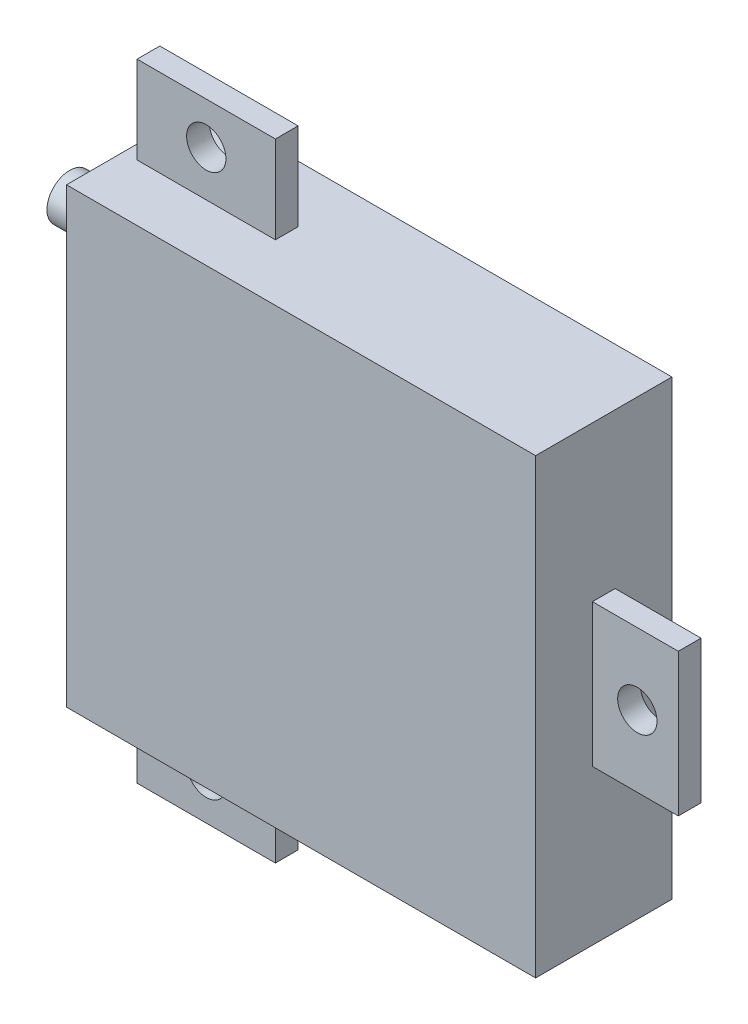
ISO-10303-21;
HEADER;
FILE_DESCRIPTION(('STEP AP214'),'2;1');
FILE_NAME('part.step','',(''),(''),'','','');
FILE_SCHEMA(('AUTOMOTIVE_DESIGN { 1 0 10303 214 1 1 1 1 }'));
ENDSEC;
DATA;
#1=APPLICATION_CONTEXT('core data for automotive mechanical design processes');
#2=APPLICATION_PROTOCOL_DEFINITION('international standard','automotive_design',2000,#1);
#3=PRODUCT_CONTEXT('',#1,'mechanical');
#4=PRODUCT('Part','Part','',(#3));
#5=PRODUCT_RELATED_PRODUCT_CATEGORY('part','',(#4));
#6=PRODUCT_DEFINITION_FORMATION('','',#4);
#7=PRODUCT_DEFINITION_CONTEXT('part definition',#1,'design');
#8=PRODUCT_DEFINITION('design','',#6,#7);
#9=PRODUCT_DEFINITION_SHAPE('','',#8);
#10=(LENGTH_UNIT() NAMED_UNIT(*) SI_UNIT(.MILLI.,.METRE.));
#11=(NAMED_UNIT(*) PLANE_ANGLE_UNIT() SI_UNIT($,.RADIAN.));
#12=(NAMED_UNIT(*) SI_UNIT($,.STERADIAN.) SOLID_ANGLE_UNIT());
#13=UNCERTAINTY_MEASURE_WITH_UNIT(LENGTH_MEASURE(1.E-05),#10,'distance_accuracy_value','');
#14=(GEOMETRIC_REPRESENTATION_CONTEXT(3) GLOBAL_UNCERTAINTY_ASSIGNED_CONTEXT((#13)) GLOBAL_UNIT_ASSIGNED_CONTEXT((#10,
#11,#12)) REPRESENTATION_CONTEXT('',''));
#15=CARTESIAN_POINT('',(0.,0.,0.));
#16=DIRECTION('',(0.,0.,1.));
#17=DIRECTION('',(1.,0.,0.));
#18=AXIS2_PLACEMENT_3D('',#15,#16,#17);
#19=CARTESIAN_POINT('',(100.173594780694,49.397945873676,3.9624));
#20=DIRECTION('',(1.,0.,0.));
#21=DIRECTION('',(0.,0.,-1.));
#22=AXIS2_PLACEMENT_3D('',#19,#20,#21);
#23=PLANE('',#22);
#24=DIRECTION('',(0.,-1.,0.));
#25=VECTOR('',#24,1.);
#26=CARTESIAN_POINT('',(100.173594780694,49.397945873676,0.));
#27=LINE('',#26,#25);
#28=CARTESIAN_POINT('',(100.173594780694,49.397945873676,0.));
#29=VERTEX_POINT('',#28);
#30=CARTESIAN_POINT('',(100.173594780694,17.8257458736761,0.));
#31=VERTEX_POINT('',#30);
#32=EDGE_CURVE('E154',#29,#31,#27,.T.);
#33=ORIENTED_EDGE('',*,*,#32,.T.);
#34=DIRECTION('',(0.,0.,-1.));
#35=VECTOR('',#34,1.);
#36=CARTESIAN_POINT('',(100.173594780694,17.8257458736761,3.9624));
#37=LINE('',#36,#35);
#38=CARTESIAN_POINT('',(100.173594780694,17.8257458736761,9.5123));
#39=VERTEX_POINT('',#38);
#40=EDGE_CURVE('E147',#39,#31,#37,.T.);
#41=ORIENTED_EDGE('',*,*,#40,.F.);
#42=DIRECTION('',(0.,-1.,0.));
#43=VECTOR('',#42,1.);
#44=CARTESIAN_POINT('',(100.173594780694,49.397945873676,9.5123));
#45=LINE('',#44,#43);
#46=CARTESIAN_POINT('',(100.173594780694,49.397945873676,9.5123));
#47=VERTEX_POINT('',#46);
#48=EDGE_CURVE('E152',#47,#39,#45,.T.);
#49=ORIENTED_EDGE('',*,*,#48,.F.);
#50=DIRECTION('',(0.,0.,-1.));
#51=VECTOR('',#50,1.);
#52=CARTESIAN_POINT('',(100.173594780694,49.397945873676,3.9624));
#53=LINE('',#52,#51);
#54=EDGE_CURVE('E257',#47,#29,#53,.T.);
#55=ORIENTED_EDGE('',*,*,#54,.T.);
#56=EDGE_LOOP('',(#33,#41,#49,#55));
#57=FACE_BOUND('',#56,.T.);
#58=CARTESIAN_POINT('',(100.173594780694,43.809945873676,4.52755));
#59=DIRECTION('',(1.,0.,0.));
#60=DIRECTION('',(0.,0.,-1.));
#61=AXIS2_PLACEMENT_3D('',#58,#59,#60);
#62=CIRCLE('',#61,1.5875);
#63=CARTESIAN_POINT('',(100.173594780694,43.809945873676,2.94005));
#64=VERTEX_POINT('',#63);
#65=EDGE_CURVE('E11',#64,#64,#62,.F.);
#66=ORIENTED_EDGE('',*,*,#65,.F.);
#67=EDGE_LOOP('',(#66));
#68=FACE_BOUND('',#67,.T.);
#69=ADVANCED_FACE('F33',(#57,#68),#23,.F.);
#70=CARTESIAN_POINT('',(0.,0.,5.5499));
#71=DIRECTION('',(0.,0.,-1.));
#72=DIRECTION('',(-1.,0.,0.));
#73=AXIS2_PLACEMENT_3D('',#70,#71,#72);
#74=PLANE('',#73);
#75=CARTESIAN_POINT('',(105.964794780695,52.572945873676,5.5499));
#76=DIRECTION('',(0.,0.,1.));
#77=DIRECTION('',(1.,0.,0.));
#78=AXIS2_PLACEMENT_3D('',#75,#76,#77);
#79=CIRCLE('',#78,1.3716);
#80=CARTESIAN_POINT('',(107.336394780695,52.572945873676,5.5499));
#81=VERTEX_POINT('',#80);
#82=EDGE_CURVE('E186',#81,#81,#79,.T.);
#83=ORIENTED_EDGE('',*,*,#82,.F.);
#84=EDGE_LOOP('',(#83));
#85=FACE_BOUND('',#84,.T.);
#86=DIRECTION('',(-1.,0.,0.));
#87=VECTOR('',#86,1.);
#88=CARTESIAN_POINT('',(100.173594780694,49.397945873676,5.5499));
#89=LINE('',#88,#87);
#90=CARTESIAN_POINT('',(110.790794780694,49.397945873676,5.5499));
#91=VERTEX_POINT('',#90);
#92=CARTESIAN_POINT('',(101.138794780694,49.397945873676,5.5499));
#93=VERTEX_POINT('',#92);
#94=EDGE_CURVE('E40',#91,#93,#89,.T.);
#95=ORIENTED_EDGE('',*,*,#94,.F.);
#96=DIRECTION('',(0.,1.,0.));
#97=VECTOR('',#96,1.);
#98=CARTESIAN_POINT('',(110.790794780694,49.397945873676,5.5499));
#99=LINE('',#98,#97);
#100=CARTESIAN_POINT('',(110.790794780694,55.4939458736762,5.5499));
#101=VERTEX_POINT('',#100);
#102=EDGE_CURVE('E209',#91,#101,#99,.T.);
#103=ORIENTED_EDGE('',*,*,#102,.T.);
#104=DIRECTION('',(-1.,0.,0.));
#105=VECTOR('',#104,1.);
#106=CARTESIAN_POINT('',(101.138794780694,55.4939458736762,5.5499));
#107=LINE('',#106,#105);
#108=CARTESIAN_POINT('',(101.138794780694,55.4939458736762,5.5499));
#109=VERTEX_POINT('',#108);
#110=EDGE_CURVE('E206',#101,#109,#107,.T.);
#111=ORIENTED_EDGE('',*,*,#110,.T.);
#112=DIRECTION('',(0.,-1.,0.));
#113=VECTOR('',#112,1.);
#114=CARTESIAN_POINT('',(101.138794780694,49.397945873676,5.5499));
#115=LINE('',#114,#113);
#116=EDGE_CURVE('E208',#109,#93,#115,.T.);
#117=ORIENTED_EDGE('',*,*,#116,.T.);
#118=EDGE_LOOP('',(#95,#103,#111,#117));
#119=FACE_BOUND('',#118,.T.);
#120=ADVANCED_FACE('F289',(#85,#119),#74,.F.);
#121=CARTESIAN_POINT('',(136.050967198386,33.6118458736753,5.5499));
#122=DIRECTION('',(0.,0.,1.));
#123=DIRECTION('',(1.,0.,0.));
#124=AXIS2_PLACEMENT_3D('',#121,#122,#123);
#125=CIRCLE('',#124,1.3716);
#126=CARTESIAN_POINT('',(137.422567198386,33.6118458736753,5.5499));
#127=VERTEX_POINT('',#126);
#128=EDGE_CURVE('E192',#127,#127,#125,.T.);
#129=ORIENTED_EDGE('',*,*,#128,.F.);
#130=EDGE_LOOP('',(#129));
#131=FACE_BOUND('',#130,.T.);
#132=DIRECTION('',(0.,1.,0.));
#133=VECTOR('',#132,1.);
#134=CARTESIAN_POINT('',(132.914194780693,49.397945873676,5.5499));
#135=LINE('',#134,#133);
#136=CARTESIAN_POINT('',(132.914194780693,28.6334458736761,5.5499));
#137=VERTEX_POINT('',#136);
#138=CARTESIAN_POINT('',(132.914194780693,38.590245873676,5.5499));
#139=VERTEX_POINT('',#138);
#140=EDGE_CURVE('E320',#137,#139,#135,.T.);
#141=ORIENTED_EDGE('',*,*,#140,.F.);
#142=DIRECTION('',(1.,0.,0.));
#143=VECTOR('',#142,1.);
#144=CARTESIAN_POINT('',(132.914194780693,28.6334458736761,5.5499));
#145=LINE('',#144,#143);
#146=CARTESIAN_POINT('',(138.908594780693,28.6334458736761,5.5499));
#147=VERTEX_POINT('',#146);
#148=EDGE_CURVE('E205',#137,#147,#145,.T.);
#149=ORIENTED_EDGE('',*,*,#148,.T.);
#150=DIRECTION('',(0.,1.,0.));
#151=VECTOR('',#150,1.);
#152=CARTESIAN_POINT('',(138.908594780693,38.590245873676,5.5499));
#153=LINE('',#152,#151);
#154=CARTESIAN_POINT('',(138.908594780693,38.590245873676,5.5499));
#155=VERTEX_POINT('',#154);
#156=EDGE_CURVE('E202',#147,#155,#153,.T.);
#157=ORIENTED_EDGE('',*,*,#156,.T.);
#158=DIRECTION('',(-1.,0.,0.));
#159=VECTOR('',#158,1.);
#160=CARTESIAN_POINT('',(132.914194780693,38.590245873676,5.5499));
#161=LINE('',#160,#159);
#162=EDGE_CURVE('E204',#155,#139,#161,.T.);
#163=ORIENTED_EDGE('',*,*,#162,.T.);
#164=EDGE_LOOP('',(#141,#149,#157,#163));
#165=FACE_BOUND('',#164,.T.);
#166=ADVANCED_FACE('F293',(#131,#165),#74,.F.);
#167=CARTESIAN_POINT('',(105.964794780695,14.6507458736761,5.5499));
#168=DIRECTION('',(0.,0.,1.));
#169=DIRECTION('',(1.,0.,0.));
#170=AXIS2_PLACEMENT_3D('',#167,#168,#169);
#171=CIRCLE('',#170,1.3716);
#172=CARTESIAN_POINT('',(107.336394780695,14.6507458736761,5.5499));
#173=VERTEX_POINT('',#172);
#174=EDGE_CURVE('E180',#173,#173,#171,.T.);
#175=ORIENTED_EDGE('',*,*,#174,.F.);
#176=EDGE_LOOP('',(#175));
#177=FACE_BOUND('',#176,.T.);
#178=DIRECTION('',(1.,0.,0.));
#179=VECTOR('',#178,1.);
#180=CARTESIAN_POINT('',(132.914194780693,17.8257458736761,5.5499));
#181=LINE('',#180,#179);
#182=CARTESIAN_POINT('',(101.138794780694,17.8257458736761,5.5499));
#183=VERTEX_POINT('',#182);
#184=CARTESIAN_POINT('',(110.790794780694,17.8257458736761,5.5499));
#185=VERTEX_POINT('',#184);
#186=EDGE_CURVE('E156',#183,#185,#181,.T.);
#187=ORIENTED_EDGE('',*,*,#186,.F.);
#188=DIRECTION('',(0.,-1.,0.));
#189=VECTOR('',#188,1.);
#190=CARTESIAN_POINT('',(101.138794780694,17.8257458736761,5.5499));
#191=LINE('',#190,#189);
#192=CARTESIAN_POINT('',(101.138794780694,11.7297458736759,5.5499));
#193=VERTEX_POINT('',#192);
#194=EDGE_CURVE('E201',#183,#193,#191,.T.);
#195=ORIENTED_EDGE('',*,*,#194,.T.);
#196=DIRECTION('',(1.,0.,0.));
#197=VECTOR('',#196,1.);
#198=CARTESIAN_POINT('',(101.138794780694,11.7297458736759,5.5499));
#199=LINE('',#198,#197);
#200=CARTESIAN_POINT('',(110.790794780694,11.7297458736759,5.5499));
#201=VERTEX_POINT('',#200);
#202=EDGE_CURVE('E198',#193,#201,#199,.T.);
#203=ORIENTED_EDGE('',*,*,#202,.T.);
#204=DIRECTION('',(0.,1.,0.));
#205=VECTOR('',#204,1.);
#206=CARTESIAN_POINT('',(110.790794780694,17.8257458736761,5.5499));
#207=LINE('',#206,#205);
#208=EDGE_CURVE('E200',#201,#185,#207,.T.);
#209=ORIENTED_EDGE('',*,*,#208,.T.);
#210=EDGE_LOOP('',(#187,#195,#203,#209));
#211=FACE_BOUND('',#210,.T.);
#212=ADVANCED_FACE('F296',(#177,#211),#74,.F.);
#213=CARTESIAN_POINT('',(132.914194780693,17.8257458736761,3.9624));
#214=DIRECTION('',(0.,1.,0.));
#215=DIRECTION('',(0.,0.,1.));
#216=AXIS2_PLACEMENT_3D('',#213,#214,#215);
#217=PLANE('',#216);
#218=DIRECTION('',(0.,0.,-1.));
#219=VECTOR('',#218,1.);
#220=CARTESIAN_POINT('',(101.138794780694,17.8257458736761,5.5499));
#221=LINE('',#220,#219);
#222=CARTESIAN_POINT('',(101.138794780694,17.8257458736761,3.9624));
#223=VERTEX_POINT('',#222);
#224=EDGE_CURVE('E244',#183,#223,#221,.T.);
#225=ORIENTED_EDGE('',*,*,#224,.F.);
#226=ORIENTED_EDGE('',*,*,#186,.T.);
#227=DIRECTION('',(0.,0.,-1.));
#228=VECTOR('',#227,1.);
#229=CARTESIAN_POINT('',(110.790794780694,17.8257458736761,5.5499));
#230=LINE('',#229,#228);
#231=CARTESIAN_POINT('',(110.790794780694,17.8257458736761,3.9624));
#232=VERTEX_POINT('',#231);
#233=EDGE_CURVE('E241',#185,#232,#230,.T.);
#234=ORIENTED_EDGE('',*,*,#233,.T.);
#235=DIRECTION('',(1.,0.,0.));
#236=VECTOR('',#235,1.);
#237=CARTESIAN_POINT('',(132.914194780693,17.8257458736761,3.9624));
#238=LINE('',#237,#236);
#239=EDGE_CURVE('E250',#223,#232,#238,.T.);
#240=ORIENTED_EDGE('',*,*,#239,.F.);
#241=EDGE_LOOP('',(#225,#226,#234,#240));
#242=FACE_BOUND('',#241,.T.);
#243=DIRECTION('',(1.,0.,0.));
#244=VECTOR('',#243,1.);
#245=CARTESIAN_POINT('',(132.914194780693,17.8257458736761,0.));
#246=LINE('',#245,#244);
#247=CARTESIAN_POINT('',(132.914194780693,17.8257458736761,0.));
#248=VERTEX_POINT('',#247);
#249=EDGE_CURVE('E262',#31,#248,#246,.T.);
#250=ORIENTED_EDGE('',*,*,#249,.T.);
#251=DIRECTION('',(0.,0.,-1.));
#252=VECTOR('',#251,1.);
#253=CARTESIAN_POINT('',(132.914194780693,17.8257458736761,3.9624));
#254=LINE('',#253,#252);
#255=CARTESIAN_POINT('',(132.914194780693,17.8257458736761,9.5123));
#256=VERTEX_POINT('',#255);
#257=EDGE_CURVE('E157',#256,#248,#254,.T.);
#258=ORIENTED_EDGE('',*,*,#257,.F.);
#259=DIRECTION('',(1.,0.,0.));
#260=VECTOR('',#259,1.);
#261=CARTESIAN_POINT('',(132.914194780693,17.8257458736761,9.5123));
#262=LINE('',#261,#260);
#263=EDGE_CURVE('E160',#39,#256,#262,.T.);
#264=ORIENTED_EDGE('',*,*,#263,.F.);
#265=ORIENTED_EDGE('',*,*,#40,.T.);
#266=EDGE_LOOP('',(#250,#258,#264,#265));
#267=FACE_BOUND('',#266,.T.);
#268=ADVANCED_FACE('F161',(#242,#267),#217,.F.);
#269=CARTESIAN_POINT('',(132.914194780693,49.397945873676,3.9624));
#270=DIRECTION('',(-1.,0.,0.));
#271=DIRECTION('',(0.,0.,1.));
#272=AXIS2_PLACEMENT_3D('',#269,#270,#271);
#273=PLANE('',#272);
#274=DIRECTION('',(0.,0.,-1.));
#275=VECTOR('',#274,1.);
#276=CARTESIAN_POINT('',(132.914194780693,28.6334458736761,5.5499));
#277=LINE('',#276,#275);
#278=CARTESIAN_POINT('',(132.914194780693,28.6334458736761,3.9624));
#279=VERTEX_POINT('',#278);
#280=EDGE_CURVE('E236',#137,#279,#277,.T.);
#281=ORIENTED_EDGE('',*,*,#280,.F.);
#282=ORIENTED_EDGE('',*,*,#140,.T.);
#283=DIRECTION('',(0.,0.,-1.));
#284=VECTOR('',#283,1.);
#285=CARTESIAN_POINT('',(132.914194780693,38.590245873676,5.5499));
#286=LINE('',#285,#284);
#287=CARTESIAN_POINT('',(132.914194780693,38.590245873676,3.9624));
#288=VERTEX_POINT('',#287);
#289=EDGE_CURVE('E233',#139,#288,#286,.T.);
#290=ORIENTED_EDGE('',*,*,#289,.T.);
#291=DIRECTION('',(0.,1.,0.));
#292=VECTOR('',#291,1.);
#293=CARTESIAN_POINT('',(132.914194780693,49.397945873676,3.9624));
#294=LINE('',#293,#292);
#295=EDGE_CURVE('E252',#279,#288,#294,.T.);
#296=ORIENTED_EDGE('',*,*,#295,.F.);
#297=EDGE_LOOP('',(#281,#282,#290,#296));
#298=FACE_BOUND('',#297,.T.);
#299=DIRECTION('',(0.,1.,0.));
#300=VECTOR('',#299,1.);
#301=CARTESIAN_POINT('',(132.914194780693,49.397945873676,0.));
#302=LINE('',#301,#300);
#303=CARTESIAN_POINT('',(132.914194780693,49.397945873676,0.));
#304=VERTEX_POINT('',#303);
#305=EDGE_CURVE('E264',#248,#304,#302,.T.);
#306=ORIENTED_EDGE('',*,*,#305,.T.);
#307=DIRECTION('',(0.,0.,-1.));
#308=VECTOR('',#307,1.);
#309=CARTESIAN_POINT('',(132.914194780693,49.397945873676,3.9624));
#310=LINE('',#309,#308);
#311=CARTESIAN_POINT('',(132.914194780693,49.397945873676,9.5123));
#312=VERTEX_POINT('',#311);
#313=EDGE_CURVE('E268',#312,#304,#310,.T.);
#314=ORIENTED_EDGE('',*,*,#313,.F.);
#315=DIRECTION('',(0.,1.,0.));
#316=VECTOR('',#315,1.);
#317=CARTESIAN_POINT('',(132.914194780693,49.397945873676,9.5123));
#318=LINE('',#317,#316);
#319=EDGE_CURVE('E166',#256,#312,#318,.T.);
#320=ORIENTED_EDGE('',*,*,#319,.F.);
#321=ORIENTED_EDGE('',*,*,#257,.T.);
#322=EDGE_LOOP('',(#306,#314,#320,#321));
#323=FACE_BOUND('',#322,.T.);
#324=ADVANCED_FACE('F272',(#298,#323),#273,.F.);
#325=CARTESIAN_POINT('',(100.173594780694,49.397945873676,3.9624));
#326=DIRECTION('',(0.,-1.,0.));
#327=DIRECTION('',(0.,0.,-1.));
#328=AXIS2_PLACEMENT_3D('',#325,#326,#327);
#329=PLANE('',#328);
#330=DIRECTION('',(0.,0.,-1.));
#331=VECTOR('',#330,1.);
#332=CARTESIAN_POINT('',(110.790794780694,49.397945873676,5.5499));
#333=LINE('',#332,#331);
#334=CARTESIAN_POINT('',(110.790794780694,49.397945873676,3.9624));
#335=VERTEX_POINT('',#334);
#336=EDGE_CURVE('E228',#91,#335,#333,.T.);
#337=ORIENTED_EDGE('',*,*,#336,.F.);
#338=ORIENTED_EDGE('',*,*,#94,.T.);
#339=DIRECTION('',(0.,0.,-1.));
#340=VECTOR('',#339,1.);
#341=CARTESIAN_POINT('',(101.138794780694,49.397945873676,5.5499));
#342=LINE('',#341,#340);
#343=CARTESIAN_POINT('',(101.138794780694,49.397945873676,3.9624));
#344=VERTEX_POINT('',#343);
#345=EDGE_CURVE('E225',#93,#344,#342,.T.);
#346=ORIENTED_EDGE('',*,*,#345,.T.);
#347=DIRECTION('',(-1.,0.,0.));
#348=VECTOR('',#347,1.);
#349=CARTESIAN_POINT('',(100.173594780694,49.397945873676,3.9624));
#350=LINE('',#349,#348);
#351=EDGE_CURVE('E47',#335,#344,#350,.T.);
#352=ORIENTED_EDGE('',*,*,#351,.F.);
#353=EDGE_LOOP('',(#337,#338,#346,#352));
#354=FACE_BOUND('',#353,.T.);
#355=DIRECTION('',(-1.,0.,0.));
#356=VECTOR('',#355,1.);
#357=CARTESIAN_POINT('',(100.173594780694,49.397945873676,0.));
#358=LINE('',#357,#356);
#359=EDGE_CURVE('E253',#304,#29,#358,.T.);
#360=ORIENTED_EDGE('',*,*,#359,.T.);
#361=ORIENTED_EDGE('',*,*,#54,.F.);
#362=DIRECTION('',(-1.,0.,0.));
#363=VECTOR('',#362,1.);
#364=CARTESIAN_POINT('',(100.173594780694,49.397945873676,9.5123));
#365=LINE('',#364,#363);
#366=EDGE_CURVE('E171',#312,#47,#365,.T.);
#367=ORIENTED_EDGE('',*,*,#366,.F.);
#368=ORIENTED_EDGE('',*,*,#313,.T.);
#369=EDGE_LOOP('',(#360,#361,#367,#368));
#370=FACE_BOUND('',#369,.T.);
#371=ADVANCED_FACE('F277',(#354,#370),#329,.F.);
#372=CARTESIAN_POINT('',(0.,0.,0.));
#373=DIRECTION('',(0.,0.,-1.));
#374=DIRECTION('',(-1.,0.,0.));
#375=AXIS2_PLACEMENT_3D('',#372,#373,#374);
#376=PLANE('',#375);
#377=ORIENTED_EDGE('',*,*,#32,.F.);
#378=ORIENTED_EDGE('',*,*,#359,.F.);
#379=ORIENTED_EDGE('',*,*,#305,.F.);
#380=ORIENTED_EDGE('',*,*,#249,.F.);
#381=EDGE_LOOP('',(#377,#378,#379,#380));
#382=FACE_BOUND('',#381,.T.);
#383=ADVANCED_FACE('F275',(#382),#376,.T.);
#384=CARTESIAN_POINT('',(0.,0.,3.9624));
#385=DIRECTION('',(0.,0.,-1.));
#386=DIRECTION('',(-1.,0.,0.));
#387=AXIS2_PLACEMENT_3D('',#384,#385,#386);
#388=PLANE('',#387);
#389=CARTESIAN_POINT('',(105.964794780695,14.6507458736761,3.9624));
#390=DIRECTION('',(0.,0.,1.));
#391=DIRECTION('',(1.,0.,0.));
#392=AXIS2_PLACEMENT_3D('',#389,#390,#391);
#393=CIRCLE('',#392,1.3716);
#394=CARTESIAN_POINT('',(107.336394780695,14.6507458736761,3.9624));
#395=VERTEX_POINT('',#394);
#396=EDGE_CURVE('E179',#395,#395,#393,.T.);
#397=ORIENTED_EDGE('',*,*,#396,.T.);
#398=EDGE_LOOP('',(#397));
#399=FACE_BOUND('',#398,.T.);
#400=DIRECTION('',(0.,-1.,0.));
#401=VECTOR('',#400,1.);
#402=CARTESIAN_POINT('',(101.138794780694,17.8257458736761,3.9624));
#403=LINE('',#402,#401);
#404=CARTESIAN_POINT('',(101.138794780694,11.7297458736759,3.9624));
#405=VERTEX_POINT('',#404);
#406=EDGE_CURVE('E195',#223,#405,#403,.T.);
#407=ORIENTED_EDGE('',*,*,#406,.F.);
#408=ORIENTED_EDGE('',*,*,#239,.T.);
#409=DIRECTION('',(0.,1.,0.));
#410=VECTOR('',#409,1.);
#411=CARTESIAN_POINT('',(110.790794780694,17.8257458736761,3.9624));
#412=LINE('',#411,#410);
#413=CARTESIAN_POINT('',(110.790794780694,11.7297458736759,3.9624));
#414=VERTEX_POINT('',#413);
#415=EDGE_CURVE('E212',#414,#232,#412,.T.);
#416=ORIENTED_EDGE('',*,*,#415,.F.);
#417=DIRECTION('',(1.,0.,0.));
#418=VECTOR('',#417,1.);
#419=CARTESIAN_POINT('',(101.138794780694,11.7297458736759,3.9624));
#420=LINE('',#419,#418);
#421=EDGE_CURVE('E210',#405,#414,#420,.T.);
#422=ORIENTED_EDGE('',*,*,#421,.F.);
#423=EDGE_LOOP('',(#407,#408,#416,#422));
#424=FACE_BOUND('',#423,.T.);
#425=ADVANCED_FACE('F284',(#399,#424),#388,.T.);
#426=CARTESIAN_POINT('',(136.050967198386,33.6118458736753,3.9624));
#427=DIRECTION('',(0.,0.,1.));
#428=DIRECTION('',(1.,0.,0.));
#429=AXIS2_PLACEMENT_3D('',#426,#427,#428);
#430=CIRCLE('',#429,1.3716);
#431=CARTESIAN_POINT('',(137.422567198386,33.6118458736753,3.9624));
#432=VERTEX_POINT('',#431);
#433=EDGE_CURVE('E189',#432,#432,#430,.T.);
#434=ORIENTED_EDGE('',*,*,#433,.T.);
#435=EDGE_LOOP('',(#434));
#436=FACE_BOUND('',#435,.T.);
#437=DIRECTION('',(1.,0.,0.));
#438=VECTOR('',#437,1.);
#439=CARTESIAN_POINT('',(132.914194780693,28.6334458736761,3.9624));
#440=LINE('',#439,#438);
#441=CARTESIAN_POINT('',(138.908594780693,28.6334458736761,3.9624));
#442=VERTEX_POINT('',#441);
#443=EDGE_CURVE('E216',#279,#442,#440,.T.);
#444=ORIENTED_EDGE('',*,*,#443,.F.);
#445=ORIENTED_EDGE('',*,*,#295,.T.);
#446=DIRECTION('',(-1.,0.,0.));
#447=VECTOR('',#446,1.);
#448=CARTESIAN_POINT('',(132.914194780693,38.590245873676,3.9624));
#449=LINE('',#448,#447);
#450=CARTESIAN_POINT('',(138.908594780693,38.590245873676,3.9624));
#451=VERTEX_POINT('',#450);
#452=EDGE_CURVE('E215',#451,#288,#449,.T.);
#453=ORIENTED_EDGE('',*,*,#452,.F.);
#454=DIRECTION('',(0.,1.,0.));
#455=VECTOR('',#454,1.);
#456=CARTESIAN_POINT('',(138.908594780693,38.590245873676,3.9624));
#457=LINE('',#456,#455);
#458=EDGE_CURVE('E213',#442,#451,#457,.T.);
#459=ORIENTED_EDGE('',*,*,#458,.F.);
#460=EDGE_LOOP('',(#444,#445,#453,#459));
#461=FACE_BOUND('',#460,.T.);
#462=ADVANCED_FACE('F418',(#436,#461),#388,.T.);
#463=CARTESIAN_POINT('',(105.964794780695,52.572945873676,3.9624));
#464=DIRECTION('',(0.,0.,1.));
#465=DIRECTION('',(1.,0.,0.));
#466=AXIS2_PLACEMENT_3D('',#463,#464,#465);
#467=CIRCLE('',#466,1.3716);
#468=CARTESIAN_POINT('',(107.336394780695,52.572945873676,3.9624));
#469=VERTEX_POINT('',#468);
#470=EDGE_CURVE('E183',#469,#469,#467,.T.);
#471=ORIENTED_EDGE('',*,*,#470,.T.);
#472=EDGE_LOOP('',(#471));
#473=FACE_BOUND('',#472,.T.);
#474=DIRECTION('',(0.,1.,0.));
#475=VECTOR('',#474,1.);
#476=CARTESIAN_POINT('',(110.790794780694,49.397945873676,3.9624));
#477=LINE('',#476,#475);
#478=CARTESIAN_POINT('',(110.790794780694,55.4939458736762,3.9624));
#479=VERTEX_POINT('',#478);
#480=EDGE_CURVE('E220',#335,#479,#477,.T.);
#481=ORIENTED_EDGE('',*,*,#480,.F.);
#482=ORIENTED_EDGE('',*,*,#351,.T.);
#483=DIRECTION('',(0.,-1.,0.));
#484=VECTOR('',#483,1.);
#485=CARTESIAN_POINT('',(101.138794780694,49.397945873676,3.9624));
#486=LINE('',#485,#484);
#487=CARTESIAN_POINT('',(101.138794780694,55.4939458736762,3.9624));
#488=VERTEX_POINT('',#487);
#489=EDGE_CURVE('E219',#488,#344,#486,.T.);
#490=ORIENTED_EDGE('',*,*,#489,.F.);
#491=DIRECTION('',(-1.,0.,0.));
#492=VECTOR('',#491,1.);
#493=CARTESIAN_POINT('',(101.138794780694,55.4939458736762,3.9624));
#494=LINE('',#493,#492);
#495=EDGE_CURVE('E217',#479,#488,#494,.T.);
#496=ORIENTED_EDGE('',*,*,#495,.F.);
#497=EDGE_LOOP('',(#481,#482,#490,#496));
#498=FACE_BOUND('',#497,.T.);
#499=ADVANCED_FACE('F414',(#473,#498),#388,.T.);
#500=CARTESIAN_POINT('',(101.138794780694,17.8257458736761,5.5499));
#501=DIRECTION('',(1.,0.,0.));
#502=DIRECTION('',(0.,0.,-1.));
#503=AXIS2_PLACEMENT_3D('',#500,#501,#502);
#504=PLANE('',#503);
#505=ORIENTED_EDGE('',*,*,#406,.T.);
#506=DIRECTION('',(0.,0.,-1.));
#507=VECTOR('',#506,1.);
#508=CARTESIAN_POINT('',(101.138794780694,11.7297458736759,5.5499));
#509=LINE('',#508,#507);
#510=EDGE_CURVE('E240',#193,#405,#509,.T.);
#511=ORIENTED_EDGE('',*,*,#510,.F.);
#512=ORIENTED_EDGE('',*,*,#194,.F.);
#513=ORIENTED_EDGE('',*,*,#224,.T.);
#514=EDGE_LOOP('',(#505,#511,#512,#513));
#515=FACE_BOUND('',#514,.T.);
#516=ADVANCED_FACE('F326',(#515),#504,.F.);
#517=CARTESIAN_POINT('',(101.138794780694,11.7297458736759,5.5499));
#518=DIRECTION('',(0.,1.,0.));
#519=DIRECTION('',(0.,0.,1.));
#520=AXIS2_PLACEMENT_3D('',#517,#518,#519);
#521=PLANE('',#520);
#522=ORIENTED_EDGE('',*,*,#421,.T.);
#523=DIRECTION('',(0.,0.,-1.));
#524=VECTOR('',#523,1.);
#525=CARTESIAN_POINT('',(110.790794780694,11.7297458736759,5.5499));
#526=LINE('',#525,#524);
#527=EDGE_CURVE('E237',#201,#414,#526,.T.);
#528=ORIENTED_EDGE('',*,*,#527,.F.);
#529=ORIENTED_EDGE('',*,*,#202,.F.);
#530=ORIENTED_EDGE('',*,*,#510,.T.);
#531=EDGE_LOOP('',(#522,#528,#529,#530));
#532=FACE_BOUND('',#531,.T.);
#533=ADVANCED_FACE('F398',(#532),#521,.F.);
#534=CARTESIAN_POINT('',(110.790794780694,17.8257458736761,5.5499));
#535=DIRECTION('',(-1.,0.,0.));
#536=DIRECTION('',(0.,-1.,0.));
#537=AXIS2_PLACEMENT_3D('',#534,#535,#536);
#538=PLANE('',#537);
#539=ORIENTED_EDGE('',*,*,#415,.T.);
#540=ORIENTED_EDGE('',*,*,#233,.F.);
#541=ORIENTED_EDGE('',*,*,#208,.F.);
#542=ORIENTED_EDGE('',*,*,#527,.T.);
#543=EDGE_LOOP('',(#539,#540,#541,#542));
#544=FACE_BOUND('',#543,.T.);
#545=ADVANCED_FACE('F402',(#544),#538,.F.);
#546=CARTESIAN_POINT('',(132.914194780693,28.6334458736761,5.5499));
#547=DIRECTION('',(0.,1.,0.));
#548=DIRECTION('',(0.,0.,1.));
#549=AXIS2_PLACEMENT_3D('',#546,#547,#548);
#550=PLANE('',#549);
#551=ORIENTED_EDGE('',*,*,#443,.T.);
#552=DIRECTION('',(0.,0.,-1.));
#553=VECTOR('',#552,1.);
#554=CARTESIAN_POINT('',(138.908594780693,28.6334458736761,5.5499));
#555=LINE('',#554,#553);
#556=EDGE_CURVE('E232',#147,#442,#555,.T.);
#557=ORIENTED_EDGE('',*,*,#556,.F.);
#558=ORIENTED_EDGE('',*,*,#148,.F.);
#559=ORIENTED_EDGE('',*,*,#280,.T.);
#560=EDGE_LOOP('',(#551,#557,#558,#559));
#561=FACE_BOUND('',#560,.T.);
#562=ADVANCED_FACE('F365',(#561),#550,.F.);
#563=CARTESIAN_POINT('',(138.908594780693,38.590245873676,5.5499));
#564=DIRECTION('',(-1.,0.,0.));
#565=DIRECTION('',(0.,0.,1.));
#566=AXIS2_PLACEMENT_3D('',#563,#564,#565);
#567=PLANE('',#566);
#568=ORIENTED_EDGE('',*,*,#458,.T.);
#569=DIRECTION('',(0.,0.,-1.));
#570=VECTOR('',#569,1.);
#571=CARTESIAN_POINT('',(138.908594780693,38.590245873676,5.5499));
#572=LINE('',#571,#570);
#573=EDGE_CURVE('E229',#155,#451,#572,.T.);
#574=ORIENTED_EDGE('',*,*,#573,.F.);
#575=ORIENTED_EDGE('',*,*,#156,.F.);
#576=ORIENTED_EDGE('',*,*,#556,.T.);
#577=EDGE_LOOP('',(#568,#574,#575,#576));
#578=FACE_BOUND('',#577,.T.);
#579=ADVANCED_FACE('F369',(#578),#567,.F.);
#580=CARTESIAN_POINT('',(132.914194780693,38.590245873676,5.5499));
#581=DIRECTION('',(0.,-1.,0.));
#582=DIRECTION('',(1.,0.,0.));
#583=AXIS2_PLACEMENT_3D('',#580,#581,#582);
#584=PLANE('',#583);
#585=ORIENTED_EDGE('',*,*,#452,.T.);
#586=ORIENTED_EDGE('',*,*,#289,.F.);
#587=ORIENTED_EDGE('',*,*,#162,.F.);
#588=ORIENTED_EDGE('',*,*,#573,.T.);
#589=EDGE_LOOP('',(#585,#586,#587,#588));
#590=FACE_BOUND('',#589,.T.);
#591=ADVANCED_FACE('F375',(#590),#584,.F.);
#592=CARTESIAN_POINT('',(110.790794780694,49.397945873676,5.5499));
#593=DIRECTION('',(-1.,0.,0.));
#594=DIRECTION('',(0.,-1.,0.));
#595=AXIS2_PLACEMENT_3D('',#592,#593,#594);
#596=PLANE('',#595);
#597=ORIENTED_EDGE('',*,*,#480,.T.);
#598=DIRECTION('',(0.,0.,-1.));
#599=VECTOR('',#598,1.);
#600=CARTESIAN_POINT('',(110.790794780694,55.4939458736762,5.5499));
#601=LINE('',#600,#599);
#602=EDGE_CURVE('E224',#101,#479,#601,.T.);
#603=ORIENTED_EDGE('',*,*,#602,.F.);
#604=ORIENTED_EDGE('',*,*,#102,.F.);
#605=ORIENTED_EDGE('',*,*,#336,.T.);
#606=EDGE_LOOP('',(#597,#603,#604,#605));
#607=FACE_BOUND('',#606,.T.);
#608=ADVANCED_FACE('F478',(#607),#596,.F.);
#609=CARTESIAN_POINT('',(101.138794780694,55.4939458736762,5.5499));
#610=DIRECTION('',(0.,-1.,0.));
#611=DIRECTION('',(0.,0.,-1.));
#612=AXIS2_PLACEMENT_3D('',#609,#610,#611);
#613=PLANE('',#612);
#614=ORIENTED_EDGE('',*,*,#495,.T.);
#615=DIRECTION('',(0.,0.,-1.));
#616=VECTOR('',#615,1.);
#617=CARTESIAN_POINT('',(101.138794780694,55.4939458736762,5.5499));
#618=LINE('',#617,#616);
#619=EDGE_CURVE('E221',#109,#488,#618,.T.);
#620=ORIENTED_EDGE('',*,*,#619,.F.);
#621=ORIENTED_EDGE('',*,*,#110,.F.);
#622=ORIENTED_EDGE('',*,*,#602,.T.);
#623=EDGE_LOOP('',(#614,#620,#621,#622));
#624=FACE_BOUND('',#623,.T.);
#625=ADVANCED_FACE('F452',(#624),#613,.F.);
#626=CARTESIAN_POINT('',(101.138794780694,49.397945873676,5.5499));
#627=DIRECTION('',(1.,0.,0.));
#628=DIRECTION('',(0.,0.,-1.));
#629=AXIS2_PLACEMENT_3D('',#626,#627,#628);
#630=PLANE('',#629);
#631=ORIENTED_EDGE('',*,*,#489,.T.);
#632=ORIENTED_EDGE('',*,*,#345,.F.);
#633=ORIENTED_EDGE('',*,*,#116,.F.);
#634=ORIENTED_EDGE('',*,*,#619,.T.);
#635=EDGE_LOOP('',(#631,#632,#633,#634));
#636=FACE_BOUND('',#635,.T.);
#637=ADVANCED_FACE('F447',(#636),#630,.F.);
#638=CARTESIAN_POINT('',(136.050967198386,33.6118458736753,5.5499));
#639=DIRECTION('',(0.,0.,-1.));
#640=DIRECTION('',(-1.,0.,0.));
#641=AXIS2_PLACEMENT_3D('',#638,#639,#640);
#642=CYLINDRICAL_SURFACE('',#641,1.3716);
#643=ORIENTED_EDGE('',*,*,#128,.T.);
#644=EDGE_LOOP('',(#643));
#645=FACE_BOUND('',#644,.T.);
#646=ORIENTED_EDGE('',*,*,#433,.F.);
#647=EDGE_LOOP('',(#646));
#648=FACE_BOUND('',#647,.T.);
#649=ADVANCED_FACE('F442',(#645,#648),#642,.F.);
#650=CARTESIAN_POINT('',(105.964794780695,52.572945873676,5.5499));
#651=DIRECTION('',(0.,0.,-1.));
#652=DIRECTION('',(-1.,0.,0.));
#653=AXIS2_PLACEMENT_3D('',#650,#651,#652);
#654=CYLINDRICAL_SURFACE('',#653,1.3716);
#655=ORIENTED_EDGE('',*,*,#82,.T.);
#656=EDGE_LOOP('',(#655));
#657=FACE_BOUND('',#656,.T.);
#658=ORIENTED_EDGE('',*,*,#470,.F.);
#659=EDGE_LOOP('',(#658));
#660=FACE_BOUND('',#659,.T.);
#661=ADVANCED_FACE('F433',(#657,#660),#654,.F.);
#662=CARTESIAN_POINT('',(105.964794780695,14.6507458736761,5.5499));
#663=DIRECTION('',(0.,0.,-1.));
#664=DIRECTION('',(-1.,0.,0.));
#665=AXIS2_PLACEMENT_3D('',#662,#663,#664);
#666=CYLINDRICAL_SURFACE('',#665,1.3716);
#667=ORIENTED_EDGE('',*,*,#174,.T.);
#668=EDGE_LOOP('',(#667));
#669=FACE_BOUND('',#668,.T.);
#670=ORIENTED_EDGE('',*,*,#396,.F.);
#671=EDGE_LOOP('',(#670));
#672=FACE_BOUND('',#671,.T.);
#673=ADVANCED_FACE('F431',(#669,#672),#666,.F.);
#674=CARTESIAN_POINT('',(0.,0.,9.5123));
#675=DIRECTION('',(0.,0.,-1.));
#676=DIRECTION('',(-1.,0.,0.));
#677=AXIS2_PLACEMENT_3D('',#674,#675,#676);
#678=PLANE('',#677);
#679=ORIENTED_EDGE('',*,*,#48,.T.);
#680=ORIENTED_EDGE('',*,*,#263,.T.);
#681=ORIENTED_EDGE('',*,*,#319,.T.);
#682=ORIENTED_EDGE('',*,*,#366,.T.);
#683=EDGE_LOOP('',(#679,#680,#681,#682));
#684=FACE_BOUND('',#683,.T.);
#685=ADVANCED_FACE('F169',(#684),#678,.F.);
#686=CARTESIAN_POINT('',(95.4110947806936,43.809945873676,4.52755));
#687=DIRECTION('',(1.,0.,0.));
#688=DIRECTION('',(0.,0.,-1.));
#689=AXIS2_PLACEMENT_3D('',#686,#687,#688);
#690=CYLINDRICAL_SURFACE('',#689,1.5875);
#691=CARTESIAN_POINT('',(95.4110947806936,43.809945873676,4.52755));
#692=DIRECTION('',(-1.,0.,0.));
#693=DIRECTION('',(0.,0.,1.));
#694=AXIS2_PLACEMENT_3D('',#691,#692,#693);
#695=CIRCLE('',#694,1.5875);
#696=CARTESIAN_POINT('',(95.4110947806937,43.809945873676,2.94005));
#697=VERTEX_POINT('',#696);
#698=EDGE_CURVE('E172',#697,#697,#695,.T.);
#699=CARTESIAN_POINT('',(95.4110947806937,43.809945873676,2.94005));
#700=CARTESIAN_POINT('',(95.4607041556937,43.809945873676,2.94005));
#701=CARTESIAN_POINT('',(95.5103135306937,43.809945873676,2.94005));
#702=CARTESIAN_POINT('',(95.6095322806936,43.809945873676,2.94005));
#703=CARTESIAN_POINT('',(95.6591416556937,43.809945873676,2.94005));
#704=CARTESIAN_POINT('',(95.7583604056937,43.809945873676,2.94005));
#705=CARTESIAN_POINT('',(95.8079697806937,43.809945873676,2.94005));
#706=CARTESIAN_POINT('',(95.9071885306936,43.809945873676,2.94005));
#707=CARTESIAN_POINT('',(95.9567979056937,43.809945873676,2.94005));
#708=CARTESIAN_POINT('',(96.0560166556936,43.809945873676,2.94005));
#709=CARTESIAN_POINT('',(96.1056260306937,43.809945873676,2.94005));
#710=CARTESIAN_POINT('',(96.2048447806936,43.809945873676,2.94005));
#711=CARTESIAN_POINT('',(96.2544541556937,43.809945873676,2.94005));
#712=CARTESIAN_POINT('',(96.3536729056936,43.809945873676,2.94005));
#713=CARTESIAN_POINT('',(96.4032822806937,43.809945873676,2.94005));
#714=CARTESIAN_POINT('',(96.5025010306937,43.809945873676,2.94005));
#715=CARTESIAN_POINT('',(96.5521104056937,43.809945873676,2.94005));
#716=CARTESIAN_POINT('',(96.6513291556936,43.809945873676,2.94005));
#717=CARTESIAN_POINT('',(96.7009385306937,43.809945873676,2.94005));
#718=CARTESIAN_POINT('',(96.8001572806937,43.809945873676,2.94005));
#719=CARTESIAN_POINT('',(96.8497666556937,43.809945873676,2.94005));
#720=CARTESIAN_POINT('',(96.9489854056936,43.809945873676,2.94005));
#721=CARTESIAN_POINT('',(96.9985947806937,43.809945873676,2.94005));
#722=CARTESIAN_POINT('',(97.0978135306936,43.809945873676,2.94005));
#723=CARTESIAN_POINT('',(97.1474229056937,43.809945873676,2.94005));
#724=CARTESIAN_POINT('',(97.2466416556937,43.809945873676,2.94005));
#725=CARTESIAN_POINT('',(97.2962510306937,43.809945873676,2.94005));
#726=CARTESIAN_POINT('',(97.3954697806936,43.809945873676,2.94005));
#727=CARTESIAN_POINT('',(97.4450791556937,43.809945873676,2.94005));
#728=CARTESIAN_POINT('',(97.5442979056937,43.809945873676,2.94005));
#729=CARTESIAN_POINT('',(97.5939072806937,43.809945873676,2.94005));
#730=CARTESIAN_POINT('',(97.6931260306936,43.809945873676,2.94005));
#731=CARTESIAN_POINT('',(97.7427354056937,43.809945873676,2.94005));
#732=CARTESIAN_POINT('',(97.8419541556936,43.809945873676,2.94005));
#733=CARTESIAN_POINT('',(97.8915635306937,43.809945873676,2.94005));
#734=CARTESIAN_POINT('',(97.9907822806937,43.809945873676,2.94005));
#735=CARTESIAN_POINT('',(98.0403916556937,43.809945873676,2.94005));
#736=CARTESIAN_POINT('',(98.1396104056936,43.809945873676,2.94005));
#737=CARTESIAN_POINT('',(98.1892197806937,43.809945873676,2.94005));
#738=CARTESIAN_POINT('',(98.2884385306937,43.809945873676,2.94005));
#739=CARTESIAN_POINT('',(98.3380479056937,43.809945873676,2.94005));
#740=CARTESIAN_POINT('',(98.4372666556936,43.809945873676,2.94005));
#741=CARTESIAN_POINT('',(98.4868760306937,43.809945873676,2.94005));
#742=CARTESIAN_POINT('',(98.5860947806936,43.809945873676,2.94005));
#743=CARTESIAN_POINT('',(98.6357041556937,43.809945873676,2.94005));
#744=CARTESIAN_POINT('',(98.7349229056937,43.809945873676,2.94005));
#745=CARTESIAN_POINT('',(98.7845322806937,43.809945873676,2.94005));
#746=CARTESIAN_POINT('',(98.8837510306936,43.809945873676,2.94005));
#747=CARTESIAN_POINT('',(98.9333604056937,43.809945873676,2.94005));
#748=CARTESIAN_POINT('',(99.0325791556937,43.809945873676,2.94005));
#749=CARTESIAN_POINT('',(99.0821885306937,43.809945873676,2.94005));
#750=CARTESIAN_POINT('',(99.1814072806936,43.809945873676,2.94005));
#751=CARTESIAN_POINT('',(99.2310166556937,43.809945873676,2.94005));
#752=CARTESIAN_POINT('',(99.3302354056936,43.809945873676,2.94005));
#753=CARTESIAN_POINT('',(99.3798447806937,43.809945873676,2.94005));
#754=CARTESIAN_POINT('',(99.4790635306937,43.809945873676,2.94005));
#755=CARTESIAN_POINT('',(99.5286729056937,43.809945873676,2.94005));
#756=CARTESIAN_POINT('',(99.6278916556936,43.809945873676,2.94005));
#757=CARTESIAN_POINT('',(99.6775010306937,43.809945873676,2.94005));
#758=CARTESIAN_POINT('',(99.7767197806937,43.809945873676,2.94005));
#759=CARTESIAN_POINT('',(99.8263291556937,43.809945873676,2.94005));
#760=CARTESIAN_POINT('',(99.9255479056936,43.809945873676,2.94005));
#761=CARTESIAN_POINT('',(99.9751572806937,43.809945873676,2.94005));
#762=CARTESIAN_POINT('',(100.074376030694,43.809945873676,2.94005));
#763=CARTESIAN_POINT('',(100.123985405694,43.809945873676,2.94005));
#764=CARTESIAN_POINT('',(100.173594780694,43.809945873676,2.94005));
#765=B_SPLINE_CURVE_WITH_KNOTS('',3,(#699,#700,#701,#702,#703,#704,#705,#706,#707,#708,#709,
#710,#711,#712,#713,#714,#715,#716,#717,#718,#719,#720,#721,#722,#723,#724,#725,#726,#727,#728,
#729,#730,#731,#732,#733,#734,#735,#736,#737,#738,#739,#740,#741,#742,#743,#744,#745,#746,#747,
#748,#749,#750,#751,#752,#753,#754,#755,#756,#757,#758,#759,#760,#761,#762,#763,#764),
.UNSPECIFIED.,.F.,.F.,(4,2,2,2,2,2,2,2,2,2,2,2,2,2,2,2,2,2,2,2,2,2,2,2,2,2,2,2,2,2,2,2,4),(0.,
0.148828124999986,0.297656249999986,0.446484374999986,0.595312499999986,0.744140624999987,
0.892968749999987,1.04179687499999,1.19062499999999,1.33945312499999,1.48828124999999,
1.63710937499999,1.78593749999999,1.93476562499999,2.08359374999999,2.23242187499999,
2.38124999999999,2.53007812499999,2.67890624999999,2.82773437499999,2.97656249999999,
3.12539062499999,3.27421874999999,3.42304687499999,3.57187499999999,3.72070312499999,
3.86953124999999,4.01835937499999,4.16718749999999,4.31601562499999,4.46484374999999,
4.61367187499997,4.76249999999998),.UNSPECIFIED.);
#766=EDGE_CURVE('BSEAM440',#697,#64,#765,.T.);
#767=ORIENTED_EDGE('',*,*,#698,.F.);
#768=ORIENTED_EDGE('',*,*,#65,.T.);
#769=ORIENTED_EDGE('',*,*,#766,.T.);
#770=ORIENTED_EDGE('',*,*,#766,.F.);
#771=EDGE_LOOP('',(#767,#769,#768,#770));
#772=FACE_BOUND('',#771,.T.);
#773=ADVANCED_FACE('F440',(#772),#690,.T.);
#774=CARTESIAN_POINT('',(95.4110947806936,43.809945873676,4.52755));
#775=DIRECTION('',(-1.,0.,0.));
#776=DIRECTION('',(0.,0.,1.));
#777=AXIS2_PLACEMENT_3D('',#774,#775,#776);
#778=PLANE('',#777);
#779=ORIENTED_EDGE('',*,*,#698,.T.);
#780=EDGE_LOOP('',(#779));
#781=FACE_BOUND('',#780,.T.);
#782=ADVANCED_FACE('F534',(#781),#778,.T.);
#783=CLOSED_SHELL('',(#69,#120,#166,#212,#268,#324,#371,#383,#425,#462,#499,#516,#533,#545,#562,
#579,#591,#608,#625,#637,#649,#661,#673,#685,#773,#782));
#784=MANIFOLD_SOLID_BREP('B2',#783);
#785=ADVANCED_BREP_SHAPE_REPRESENTATION('',(#18,#784),#14);
#786=SHAPE_DEFINITION_REPRESENTATION(#9,#785);
ENDSEC;
END-ISO-10303-21;
